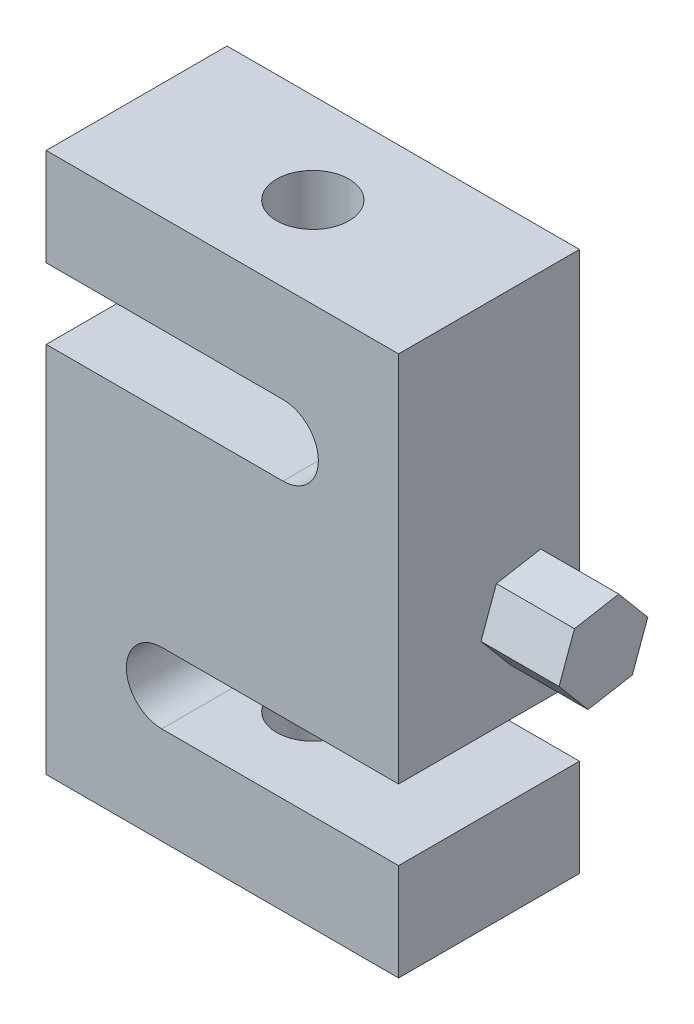
ISO-10303-21;
HEADER;
FILE_DESCRIPTION(('STEP AP214'),'2;1');
FILE_NAME('part.step','',(''),(''),'','','');
FILE_SCHEMA(('AUTOMOTIVE_DESIGN { 1 0 10303 214 1 1 1 1 }'));
ENDSEC;
DATA;
#1=APPLICATION_CONTEXT('core data for automotive mechanical design processes');
#2=APPLICATION_PROTOCOL_DEFINITION('international standard','automotive_design',2000,#1);
#3=PRODUCT_CONTEXT('',#1,'mechanical');
#4=PRODUCT('Part','Part','',(#3));
#5=PRODUCT_RELATED_PRODUCT_CATEGORY('part','',(#4));
#6=PRODUCT_DEFINITION_FORMATION('','',#4);
#7=PRODUCT_DEFINITION_CONTEXT('part definition',#1,'design');
#8=PRODUCT_DEFINITION('design','',#6,#7);
#9=PRODUCT_DEFINITION_SHAPE('','',#8);
#10=(LENGTH_UNIT() NAMED_UNIT(*) SI_UNIT(.MILLI.,.METRE.));
#11=(NAMED_UNIT(*) PLANE_ANGLE_UNIT() SI_UNIT($,.RADIAN.));
#12=(NAMED_UNIT(*) SI_UNIT($,.STERADIAN.) SOLID_ANGLE_UNIT());
#13=UNCERTAINTY_MEASURE_WITH_UNIT(LENGTH_MEASURE(1.E-05),#10,'distance_accuracy_value','');
#14=(GEOMETRIC_REPRESENTATION_CONTEXT(3) GLOBAL_UNCERTAINTY_ASSIGNED_CONTEXT((#13)) GLOBAL_UNIT_ASSIGNED_CONTEXT((#10,
#11,#12)) REPRESENTATION_CONTEXT('',''));
#15=CARTESIAN_POINT('',(0.,0.,0.));
#16=DIRECTION('',(0.,0.,1.));
#17=DIRECTION('',(1.,0.,0.));
#18=AXIS2_PLACEMENT_3D('',#15,#16,#17);
#19=CARTESIAN_POINT('',(0.,38.0873,25.4889));
#20=DIRECTION('',(0.,-1.,0.));
#21=DIRECTION('',(1.,0.,0.));
#22=AXIS2_PLACEMENT_3D('',#19,#20,#21);
#23=PLANE('',#22);
#24=DIRECTION('',(-1.,0.,0.));
#25=VECTOR('',#24,1.);
#26=CARTESIAN_POINT('',(0.,38.0873,0.));
#27=LINE('',#26,#25);
#28=CARTESIAN_POINT('',(24.8285,38.0873,0.));
#29=VERTEX_POINT('',#28);
#30=CARTESIAN_POINT('',(-24.8285,38.0873,0.));
#31=VERTEX_POINT('',#30);
#32=EDGE_CURVE('E279',#29,#31,#27,.T.);
#33=ORIENTED_EDGE('',*,*,#32,.T.);
#34=DIRECTION('',(0.,0.,-1.));
#35=VECTOR('',#34,1.);
#36=CARTESIAN_POINT('',(-24.8285,38.0873,25.4889));
#37=LINE('',#36,#35);
#38=CARTESIAN_POINT('',(-24.8285,38.0873,25.4889));
#39=VERTEX_POINT('',#38);
#40=EDGE_CURVE('E286',#39,#31,#37,.T.);
#41=ORIENTED_EDGE('',*,*,#40,.F.);
#42=DIRECTION('',(-1.,0.,0.));
#43=VECTOR('',#42,1.);
#44=CARTESIAN_POINT('',(0.,38.0873,25.4889));
#45=LINE('',#44,#43);
#46=CARTESIAN_POINT('',(24.8285,38.0873,25.4889));
#47=VERTEX_POINT('',#46);
#48=EDGE_CURVE('E245',#47,#39,#45,.T.);
#49=ORIENTED_EDGE('',*,*,#48,.F.);
#50=DIRECTION('',(0.,0.,-1.));
#51=VECTOR('',#50,1.);
#52=CARTESIAN_POINT('',(24.8285,38.0873,25.4889));
#53=LINE('',#52,#51);
#54=EDGE_CURVE('E289',#47,#29,#53,.T.);
#55=ORIENTED_EDGE('',*,*,#54,.T.);
#56=EDGE_LOOP('',(#33,#41,#49,#55));
#57=FACE_BOUND('',#56,.T.);
#58=CARTESIAN_POINT('',(0.,38.0873,12.74445));
#59=DIRECTION('',(0.,1.,0.));
#60=DIRECTION('',(0.,0.,1.));
#61=AXIS2_PLACEMENT_3D('',#58,#59,#60);
#62=CIRCLE('',#61,5.1);
#63=CARTESIAN_POINT('',(0.,38.0873,17.84445));
#64=VERTEX_POINT('',#63);
#65=EDGE_CURVE('E411',#64,#64,#62,.T.);
#66=ORIENTED_EDGE('',*,*,#65,.F.);
#67=EDGE_LOOP('',(#66));
#68=FACE_BOUND('',#67,.T.);
#69=ADVANCED_FACE('F47',(#57,#68),#23,.F.);
#70=CARTESIAN_POINT('',(24.8285,0.,25.4889));
#71=DIRECTION('',(-1.,0.,0.));
#72=DIRECTION('',(0.,0.,1.));
#73=AXIS2_PLACEMENT_3D('',#70,#71,#72);
#74=PLANE('',#73);
#75=DIRECTION('',(0.,1.,0.));
#76=VECTOR('',#75,1.);
#77=CARTESIAN_POINT('',(24.8285,0.,0.));
#78=LINE('',#77,#76);
#79=CARTESIAN_POINT('',(24.8285,-14.4145,0.));
#80=VERTEX_POINT('',#79);
#81=EDGE_CURVE('E267',#80,#29,#78,.T.);
#82=ORIENTED_EDGE('',*,*,#81,.T.);
#83=ORIENTED_EDGE('',*,*,#54,.F.);
#84=DIRECTION('',(0.,1.,0.));
#85=VECTOR('',#84,1.);
#86=CARTESIAN_POINT('',(24.8285,0.,25.4889));
#87=LINE('',#86,#85);
#88=CARTESIAN_POINT('',(24.8285,-14.4145,25.4889));
#89=VERTEX_POINT('',#88);
#90=EDGE_CURVE('E234',#89,#47,#87,.T.);
#91=ORIENTED_EDGE('',*,*,#90,.F.);
#92=DIRECTION('',(0.,0.,-1.));
#93=VECTOR('',#92,1.);
#94=CARTESIAN_POINT('',(24.8285,-14.4145,25.4889));
#95=LINE('',#94,#93);
#96=EDGE_CURVE('E293',#89,#80,#95,.T.);
#97=ORIENTED_EDGE('',*,*,#96,.T.);
#98=EDGE_LOOP('',(#82,#83,#91,#97));
#99=FACE_BOUND('',#98,.T.);
#100=DIRECTION('',(0.,-0.173422772092117,0.984847471499971));
#101=VECTOR('',#100,1.);
#102=CARTESIAN_POINT('',(24.8285,4.2520509016337,5.44680641952582));
#103=LINE('',#102,#101);
#104=CARTESIAN_POINT('',(24.8285,4.2520509016337,5.44680641952582));
#105=VERTEX_POINT('',#104);
#106=CARTESIAN_POINT('',(24.8285,3.15081629884875,11.7005878635506));
#107=VERTEX_POINT('',#106);
#108=EDGE_CURVE('E196',#105,#107,#103,.T.);
#109=ORIENTED_EDGE('',*,*,#108,.F.);
#110=DIRECTION('',(0.,0.766191543125787,0.642612261976477));
#111=VECTOR('',#110,1.);
#112=CARTESIAN_POINT('',(24.8285,-0.613265397215052,1.36621855597519));
#113=LINE('',#112,#111);
#114=CARTESIAN_POINT('',(24.8285,-0.613265397215052,1.36621855597519));
#115=VERTEX_POINT('',#114);
#116=EDGE_CURVE('E193',#115,#105,#113,.T.);
#117=ORIENTED_EDGE('',*,*,#116,.F.);
#118=DIRECTION('',(0.,0.939614315217904,-0.342235209523493));
#119=VECTOR('',#118,1.);
#120=CARTESIAN_POINT('',(24.8285,-6.57981629884874,3.53941213644937));
#121=LINE('',#120,#119);
#122=CARTESIAN_POINT('',(24.8285,-6.57981629884874,3.53941213644937));
#123=VERTEX_POINT('',#122);
#124=EDGE_CURVE('E446',#123,#115,#121,.T.);
#125=ORIENTED_EDGE('',*,*,#124,.F.);
#126=DIRECTION('',(0.,0.173422772092117,-0.984847471499971));
#127=VECTOR('',#126,1.);
#128=CARTESIAN_POINT('',(24.8285,-7.68105090163368,9.79319358047418));
#129=LINE('',#128,#127);
#130=CARTESIAN_POINT('',(24.8285,-7.68105090163368,9.79319358047418));
#131=VERTEX_POINT('',#130);
#132=EDGE_CURVE('E442',#131,#123,#129,.T.);
#133=ORIENTED_EDGE('',*,*,#132,.F.);
#134=DIRECTION('',(0.,-0.766191543125787,-0.642612261976477));
#135=VECTOR('',#134,1.);
#136=CARTESIAN_POINT('',(24.8285,-2.81573460278493,13.8737814440248));
#137=LINE('',#136,#135);
#138=CARTESIAN_POINT('',(24.8285,-2.81573460278493,13.8737814440248));
#139=VERTEX_POINT('',#138);
#140=EDGE_CURVE('E69',#139,#131,#137,.T.);
#141=ORIENTED_EDGE('',*,*,#140,.F.);
#142=DIRECTION('',(0.,-0.939614315217904,0.342235209523493));
#143=VECTOR('',#142,1.);
#144=CARTESIAN_POINT('',(24.8285,3.15081629884875,11.7005878635506));
#145=LINE('',#144,#143);
#146=EDGE_CURVE('E64',#107,#139,#145,.T.);
#147=ORIENTED_EDGE('',*,*,#146,.F.);
#148=EDGE_LOOP('',(#109,#117,#125,#133,#141,#147));
#149=FACE_BOUND('',#148,.T.);
#150=ADVANCED_FACE('F351',(#99,#149),#74,.F.);
#151=CARTESIAN_POINT('',(0.,24.3713,25.4889));
#152=DIRECTION('',(0.,1.,0.));
#153=DIRECTION('',(0.,0.,1.));
#154=AXIS2_PLACEMENT_3D('',#151,#152,#153);
#155=PLANE('',#154);
#156=CARTESIAN_POINT('',(0.,24.3713,12.74445));
#157=DIRECTION('',(0.,1.,0.));
#158=DIRECTION('',(0.,0.,1.));
#159=AXIS2_PLACEMENT_3D('',#156,#157,#158);
#160=CIRCLE('',#159,5.1);
#161=CARTESIAN_POINT('',(0.,24.3713,17.84445));
#162=VERTEX_POINT('',#161);
#163=EDGE_CURVE('E416',#162,#162,#160,.T.);
#164=ORIENTED_EDGE('',*,*,#163,.T.);
#165=EDGE_LOOP('',(#164));
#166=FACE_BOUND('',#165,.T.);
#167=DIRECTION('',(1.,0.,0.));
#168=VECTOR('',#167,1.);
#169=CARTESIAN_POINT('',(0.,24.3713,0.));
#170=LINE('',#169,#168);
#171=CARTESIAN_POINT('',(-24.8285,24.3713,0.));
#172=VERTEX_POINT('',#171);
#173=CARTESIAN_POINT('',(8.5471,24.3713,0.));
#174=VERTEX_POINT('',#173);
#175=EDGE_CURVE('E198',#172,#174,#170,.T.);
#176=ORIENTED_EDGE('',*,*,#175,.T.);
#177=DIRECTION('',(0.,0.,-1.));
#178=VECTOR('',#177,1.);
#179=CARTESIAN_POINT('',(8.5471,24.3713,25.4889));
#180=LINE('',#179,#178);
#181=CARTESIAN_POINT('',(8.5471,24.3713,25.4889));
#182=VERTEX_POINT('',#181);
#183=EDGE_CURVE('E11',#182,#174,#180,.T.);
#184=ORIENTED_EDGE('',*,*,#183,.F.);
#185=DIRECTION('',(1.,0.,0.));
#186=VECTOR('',#185,1.);
#187=CARTESIAN_POINT('',(0.,24.3713,25.4889));
#188=LINE('',#187,#186);
#189=CARTESIAN_POINT('',(-24.8285,24.3713,25.4889));
#190=VERTEX_POINT('',#189);
#191=EDGE_CURVE('E209',#190,#182,#188,.T.);
#192=ORIENTED_EDGE('',*,*,#191,.F.);
#193=DIRECTION('',(0.,0.,-1.));
#194=VECTOR('',#193,1.);
#195=CARTESIAN_POINT('',(-24.8285,24.3713,25.4889));
#196=LINE('',#195,#194);
#197=EDGE_CURVE('E283',#190,#172,#196,.T.);
#198=ORIENTED_EDGE('',*,*,#197,.T.);
#199=EDGE_LOOP('',(#176,#184,#192,#198));
#200=FACE_BOUND('',#199,.T.);
#201=ADVANCED_FACE('F49',(#166,#200),#155,.F.);
#202=CARTESIAN_POINT('',(8.5471,19.3929,25.4889));
#203=DIRECTION('',(0.,0.,-1.));
#204=DIRECTION('',(-1.,0.,0.));
#205=AXIS2_PLACEMENT_3D('',#202,#203,#204);
#206=CYLINDRICAL_SURFACE('',#205,4.9784);
#207=CARTESIAN_POINT('',(8.5471,19.3929,0.));
#208=DIRECTION('',(0.,0.,1.));
#209=DIRECTION('',(1.,0.,0.));
#210=AXIS2_PLACEMENT_3D('',#207,#208,#209);
#211=CIRCLE('',#210,4.9784);
#212=CARTESIAN_POINT('',(8.5471,14.4145,0.));
#213=VERTEX_POINT('',#212);
#214=EDGE_CURVE('E203',#174,#213,#211,.F.);
#215=ORIENTED_EDGE('',*,*,#214,.T.);
#216=DIRECTION('',(0.,0.,-1.));
#217=VECTOR('',#216,1.);
#218=CARTESIAN_POINT('',(8.5471,14.4145,25.4889));
#219=LINE('',#218,#217);
#220=CARTESIAN_POINT('',(8.5471,14.4145,25.4889));
#221=VERTEX_POINT('',#220);
#222=EDGE_CURVE('E57',#221,#213,#219,.T.);
#223=ORIENTED_EDGE('',*,*,#222,.F.);
#224=CARTESIAN_POINT('',(8.5471,19.3929,25.4889));
#225=DIRECTION('',(0.,0.,1.));
#226=DIRECTION('',(1.,0.,0.));
#227=AXIS2_PLACEMENT_3D('',#224,#225,#226);
#228=CIRCLE('',#227,4.9784);
#229=EDGE_CURVE('E213',#182,#221,#228,.F.);
#230=ORIENTED_EDGE('',*,*,#229,.F.);
#231=ORIENTED_EDGE('',*,*,#183,.T.);
#232=EDGE_LOOP('',(#215,#223,#230,#231));
#233=FACE_BOUND('',#232,.T.);
#234=ADVANCED_FACE('F322',(#233),#206,.F.);
#235=CARTESIAN_POINT('',(0.,14.4145,25.4889));
#236=DIRECTION('',(0.,1.,0.));
#237=DIRECTION('',(-1.,0.,0.));
#238=AXIS2_PLACEMENT_3D('',#235,#236,#237);
#239=PLANE('',#238);
#240=DIRECTION('',(1.,0.,0.));
#241=VECTOR('',#240,1.);
#242=CARTESIAN_POINT('',(0.,14.4145,0.));
#243=LINE('',#242,#241);
#244=CARTESIAN_POINT('',(-24.8285,14.4145,0.));
#245=VERTEX_POINT('',#244);
#246=EDGE_CURVE('E251',#245,#213,#243,.T.);
#247=ORIENTED_EDGE('',*,*,#246,.F.);
#248=DIRECTION('',(0.,0.,-1.));
#249=VECTOR('',#248,1.);
#250=CARTESIAN_POINT('',(-24.8285,14.4145,25.4889));
#251=LINE('',#250,#249);
#252=CARTESIAN_POINT('',(-24.8285,14.4145,25.4889));
#253=VERTEX_POINT('',#252);
#254=EDGE_CURVE('E312',#253,#245,#251,.T.);
#255=ORIENTED_EDGE('',*,*,#254,.F.);
#256=DIRECTION('',(1.,0.,0.));
#257=VECTOR('',#256,1.);
#258=CARTESIAN_POINT('',(0.,14.4145,25.4889));
#259=LINE('',#258,#257);
#260=EDGE_CURVE('E217',#253,#221,#259,.T.);
#261=ORIENTED_EDGE('',*,*,#260,.T.);
#262=ORIENTED_EDGE('',*,*,#222,.T.);
#263=EDGE_LOOP('',(#247,#255,#261,#262));
#264=FACE_BOUND('',#263,.T.);
#265=ADVANCED_FACE('F319',(#264),#239,.T.);
#266=CARTESIAN_POINT('',(-24.8285,0.,25.4889));
#267=DIRECTION('',(-1.,0.,0.));
#268=DIRECTION('',(0.,0.,1.));
#269=AXIS2_PLACEMENT_3D('',#266,#267,#268);
#270=PLANE('',#269);
#271=DIRECTION('',(0.,1.,0.));
#272=VECTOR('',#271,1.);
#273=CARTESIAN_POINT('',(-24.8285,0.,0.));
#274=LINE('',#273,#272);
#275=CARTESIAN_POINT('',(-24.8285,-38.0873,0.));
#276=VERTEX_POINT('',#275);
#277=EDGE_CURVE('E255',#276,#245,#274,.T.);
#278=ORIENTED_EDGE('',*,*,#277,.F.);
#279=DIRECTION('',(0.,0.,-1.));
#280=VECTOR('',#279,1.);
#281=CARTESIAN_POINT('',(-24.8285,-38.0873,25.4889));
#282=LINE('',#281,#280);
#283=CARTESIAN_POINT('',(-24.8285,-38.0873,25.4889));
#284=VERTEX_POINT('',#283);
#285=EDGE_CURVE('E309',#284,#276,#282,.T.);
#286=ORIENTED_EDGE('',*,*,#285,.F.);
#287=DIRECTION('',(0.,1.,0.));
#288=VECTOR('',#287,1.);
#289=CARTESIAN_POINT('',(-24.8285,0.,25.4889));
#290=LINE('',#289,#288);
#291=EDGE_CURVE('E221',#284,#253,#290,.T.);
#292=ORIENTED_EDGE('',*,*,#291,.T.);
#293=ORIENTED_EDGE('',*,*,#254,.T.);
#294=EDGE_LOOP('',(#278,#286,#292,#293));
#295=FACE_BOUND('',#294,.T.);
#296=ADVANCED_FACE('F331',(#295),#270,.T.);
#297=CARTESIAN_POINT('',(0.,-38.0873,25.4889));
#298=DIRECTION('',(0.,-1.,0.));
#299=DIRECTION('',(1.,0.,0.));
#300=AXIS2_PLACEMENT_3D('',#297,#298,#299);
#301=PLANE('',#300);
#302=CARTESIAN_POINT('',(0.,-38.0873,12.74445));
#303=DIRECTION('',(0.,-1.,0.));
#304=DIRECTION('',(0.,0.,-1.));
#305=AXIS2_PLACEMENT_3D('',#302,#303,#304);
#306=CIRCLE('',#305,5.1);
#307=CARTESIAN_POINT('',(0.,-38.0873,7.64445000000001));
#308=VERTEX_POINT('',#307);
#309=EDGE_CURVE('E412',#308,#308,#306,.T.);
#310=ORIENTED_EDGE('',*,*,#309,.F.);
#311=EDGE_LOOP('',(#310));
#312=FACE_BOUND('',#311,.T.);
#313=DIRECTION('',(-1.,0.,0.));
#314=VECTOR('',#313,1.);
#315=CARTESIAN_POINT('',(0.,-38.0873,0.));
#316=LINE('',#315,#314);
#317=CARTESIAN_POINT('',(24.8285,-38.0873,0.));
#318=VERTEX_POINT('',#317);
#319=EDGE_CURVE('E259',#318,#276,#316,.T.);
#320=ORIENTED_EDGE('',*,*,#319,.F.);
#321=DIRECTION('',(0.,0.,-1.));
#322=VECTOR('',#321,1.);
#323=CARTESIAN_POINT('',(24.8285,-38.0873,25.4889));
#324=LINE('',#323,#322);
#325=CARTESIAN_POINT('',(24.8285,-38.0873,25.4889));
#326=VERTEX_POINT('',#325);
#327=EDGE_CURVE('E306',#326,#318,#324,.T.);
#328=ORIENTED_EDGE('',*,*,#327,.F.);
#329=DIRECTION('',(-1.,0.,0.));
#330=VECTOR('',#329,1.);
#331=CARTESIAN_POINT('',(0.,-38.0873,25.4889));
#332=LINE('',#331,#330);
#333=EDGE_CURVE('E225',#326,#284,#332,.T.);
#334=ORIENTED_EDGE('',*,*,#333,.T.);
#335=ORIENTED_EDGE('',*,*,#285,.T.);
#336=EDGE_LOOP('',(#320,#328,#334,#335));
#337=FACE_BOUND('',#336,.T.);
#338=ADVANCED_FACE('F376',(#312,#337),#301,.T.);
#339=CARTESIAN_POINT('',(24.8285,-24.3713,0.));
#340=VERTEX_POINT('',#339);
#341=EDGE_CURVE('E263',#318,#340,#78,.T.);
#342=ORIENTED_EDGE('',*,*,#341,.T.);
#343=DIRECTION('',(0.,0.,-1.));
#344=VECTOR('',#343,1.);
#345=CARTESIAN_POINT('',(24.8285,-24.3713,25.4889));
#346=LINE('',#345,#344);
#347=CARTESIAN_POINT('',(24.8285,-24.3713,25.4889));
#348=VERTEX_POINT('',#347);
#349=EDGE_CURVE('E302',#348,#340,#346,.T.);
#350=ORIENTED_EDGE('',*,*,#349,.F.);
#351=EDGE_CURVE('E230',#326,#348,#87,.T.);
#352=ORIENTED_EDGE('',*,*,#351,.F.);
#353=ORIENTED_EDGE('',*,*,#327,.T.);
#354=EDGE_LOOP('',(#342,#350,#352,#353));
#355=FACE_BOUND('',#354,.T.);
#356=ADVANCED_FACE('F374',(#355),#74,.F.);
#357=CARTESIAN_POINT('',(0.,-24.3713,25.4889));
#358=DIRECTION('',(0.,-1.,0.));
#359=DIRECTION('',(1.,0.,0.));
#360=AXIS2_PLACEMENT_3D('',#357,#358,#359);
#361=PLANE('',#360);
#362=CARTESIAN_POINT('',(0.,-24.3713,12.74445));
#363=DIRECTION('',(0.,-1.,0.));
#364=DIRECTION('',(1.,0.,0.));
#365=AXIS2_PLACEMENT_3D('',#362,#363,#364);
#366=CIRCLE('',#365,5.1);
#367=CARTESIAN_POINT('',(5.1,-24.3713,12.74445));
#368=VERTEX_POINT('',#367);
#369=EDGE_CURVE('E51',#368,#368,#366,.T.);
#370=ORIENTED_EDGE('',*,*,#369,.T.);
#371=EDGE_LOOP('',(#370));
#372=FACE_BOUND('',#371,.T.);
#373=DIRECTION('',(-1.,0.,0.));
#374=VECTOR('',#373,1.);
#375=CARTESIAN_POINT('',(0.,-24.3713,0.));
#376=LINE('',#375,#374);
#377=CARTESIAN_POINT('',(-8.5471,-24.3713,0.));
#378=VERTEX_POINT('',#377);
#379=EDGE_CURVE('E266',#340,#378,#376,.T.);
#380=ORIENTED_EDGE('',*,*,#379,.T.);
#381=DIRECTION('',(0.,0.,-1.));
#382=VECTOR('',#381,1.);
#383=CARTESIAN_POINT('',(-8.5471,-24.3713,25.4889));
#384=LINE('',#383,#382);
#385=CARTESIAN_POINT('',(-8.5471,-24.3713,25.4889));
#386=VERTEX_POINT('',#385);
#387=EDGE_CURVE('E299',#386,#378,#384,.T.);
#388=ORIENTED_EDGE('',*,*,#387,.F.);
#389=DIRECTION('',(-1.,0.,0.));
#390=VECTOR('',#389,1.);
#391=CARTESIAN_POINT('',(0.,-24.3713,25.4889));
#392=LINE('',#391,#390);
#393=EDGE_CURVE('E233',#348,#386,#392,.T.);
#394=ORIENTED_EDGE('',*,*,#393,.F.);
#395=ORIENTED_EDGE('',*,*,#349,.T.);
#396=EDGE_LOOP('',(#380,#388,#394,#395));
#397=FACE_BOUND('',#396,.T.);
#398=ADVANCED_FACE('F370',(#372,#397),#361,.F.);
#399=CARTESIAN_POINT('',(-8.5471,-19.3929,25.4889));
#400=DIRECTION('',(0.,0.,-1.));
#401=DIRECTION('',(-1.,0.,0.));
#402=AXIS2_PLACEMENT_3D('',#399,#400,#401);
#403=CYLINDRICAL_SURFACE('',#402,4.9784);
#404=CARTESIAN_POINT('',(-8.5471,-19.3929,0.));
#405=DIRECTION('',(0.,0.,1.));
#406=DIRECTION('',(1.,0.,0.));
#407=AXIS2_PLACEMENT_3D('',#404,#405,#406);
#408=CIRCLE('',#407,4.9784);
#409=CARTESIAN_POINT('',(-8.5471,-14.4145,0.));
#410=VERTEX_POINT('',#409);
#411=EDGE_CURVE('E271',#410,#378,#408,.T.);
#412=ORIENTED_EDGE('',*,*,#411,.F.);
#413=DIRECTION('',(0.,0.,-1.));
#414=VECTOR('',#413,1.);
#415=CARTESIAN_POINT('',(-8.5471,-14.4145,25.4889));
#416=LINE('',#415,#414);
#417=CARTESIAN_POINT('',(-8.5471,-14.4145,25.4889));
#418=VERTEX_POINT('',#417);
#419=EDGE_CURVE('E296',#418,#410,#416,.T.);
#420=ORIENTED_EDGE('',*,*,#419,.F.);
#421=CARTESIAN_POINT('',(-8.5471,-19.3929,25.4889));
#422=DIRECTION('',(0.,0.,1.));
#423=DIRECTION('',(1.,0.,0.));
#424=AXIS2_PLACEMENT_3D('',#421,#422,#423);
#425=CIRCLE('',#424,4.9784);
#426=EDGE_CURVE('E237',#418,#386,#425,.T.);
#427=ORIENTED_EDGE('',*,*,#426,.T.);
#428=ORIENTED_EDGE('',*,*,#387,.T.);
#429=EDGE_LOOP('',(#412,#420,#427,#428));
#430=FACE_BOUND('',#429,.T.);
#431=ADVANCED_FACE('F366',(#430),#403,.F.);
#432=CARTESIAN_POINT('',(0.,-14.4145,25.4889));
#433=DIRECTION('',(0.,-1.,0.));
#434=DIRECTION('',(1.,0.,0.));
#435=AXIS2_PLACEMENT_3D('',#432,#433,#434);
#436=PLANE('',#435);
#437=DIRECTION('',(-1.,0.,0.));
#438=VECTOR('',#437,1.);
#439=CARTESIAN_POINT('',(0.,-14.4145,0.));
#440=LINE('',#439,#438);
#441=EDGE_CURVE('E275',#80,#410,#440,.T.);
#442=ORIENTED_EDGE('',*,*,#441,.F.);
#443=ORIENTED_EDGE('',*,*,#96,.F.);
#444=DIRECTION('',(-1.,0.,0.));
#445=VECTOR('',#444,1.);
#446=CARTESIAN_POINT('',(0.,-14.4145,25.4889));
#447=LINE('',#446,#445);
#448=EDGE_CURVE('E241',#89,#418,#447,.T.);
#449=ORIENTED_EDGE('',*,*,#448,.T.);
#450=ORIENTED_EDGE('',*,*,#419,.T.);
#451=EDGE_LOOP('',(#442,#443,#449,#450));
#452=FACE_BOUND('',#451,.T.);
#453=ADVANCED_FACE('F362',(#452),#436,.T.);
#454=EDGE_CURVE('E214',#172,#31,#274,.T.);
#455=ORIENTED_EDGE('',*,*,#454,.F.);
#456=ORIENTED_EDGE('',*,*,#197,.F.);
#457=EDGE_CURVE('E226',#190,#39,#290,.T.);
#458=ORIENTED_EDGE('',*,*,#457,.T.);
#459=ORIENTED_EDGE('',*,*,#40,.T.);
#460=EDGE_LOOP('',(#455,#456,#458,#459));
#461=FACE_BOUND('',#460,.T.);
#462=ADVANCED_FACE('F344',(#461),#270,.T.);
#463=CARTESIAN_POINT('',(0.,0.,25.4889));
#464=DIRECTION('',(0.,0.,1.));
#465=DIRECTION('',(1.,0.,0.));
#466=AXIS2_PLACEMENT_3D('',#463,#464,#465);
#467=PLANE('',#466);
#468=ORIENTED_EDGE('',*,*,#191,.T.);
#469=ORIENTED_EDGE('',*,*,#229,.T.);
#470=ORIENTED_EDGE('',*,*,#260,.F.);
#471=ORIENTED_EDGE('',*,*,#291,.F.);
#472=ORIENTED_EDGE('',*,*,#333,.F.);
#473=ORIENTED_EDGE('',*,*,#351,.T.);
#474=ORIENTED_EDGE('',*,*,#393,.T.);
#475=ORIENTED_EDGE('',*,*,#426,.F.);
#476=ORIENTED_EDGE('',*,*,#448,.F.);
#477=ORIENTED_EDGE('',*,*,#90,.T.);
#478=ORIENTED_EDGE('',*,*,#48,.T.);
#479=ORIENTED_EDGE('',*,*,#457,.F.);
#480=EDGE_LOOP('',(#468,#469,#470,#471,#472,#473,#474,#475,#476,#477,#478,#479));
#481=FACE_BOUND('',#480,.T.);
#482=ADVANCED_FACE('F334',(#481),#467,.T.);
#483=CARTESIAN_POINT('',(0.,0.,0.));
#484=DIRECTION('',(0.,0.,1.));
#485=DIRECTION('',(1.,0.,0.));
#486=AXIS2_PLACEMENT_3D('',#483,#484,#485);
#487=PLANE('',#486);
#488=ORIENTED_EDGE('',*,*,#175,.F.);
#489=ORIENTED_EDGE('',*,*,#454,.T.);
#490=ORIENTED_EDGE('',*,*,#32,.F.);
#491=ORIENTED_EDGE('',*,*,#81,.F.);
#492=ORIENTED_EDGE('',*,*,#441,.T.);
#493=ORIENTED_EDGE('',*,*,#411,.T.);
#494=ORIENTED_EDGE('',*,*,#379,.F.);
#495=ORIENTED_EDGE('',*,*,#341,.F.);
#496=ORIENTED_EDGE('',*,*,#319,.T.);
#497=ORIENTED_EDGE('',*,*,#277,.T.);
#498=ORIENTED_EDGE('',*,*,#246,.T.);
#499=ORIENTED_EDGE('',*,*,#214,.F.);
#500=EDGE_LOOP('',(#488,#489,#490,#491,#492,#493,#494,#495,#496,#497,#498,#499));
#501=FACE_BOUND('',#500,.T.);
#502=ADVANCED_FACE('F326',(#501),#487,.F.);
#503=CARTESIAN_POINT('',(35.8267,4.2520509016337,5.44680641952582));
#504=DIRECTION('',(0.,-0.984847471499971,-0.173422772092117));
#505=DIRECTION('',(0.,0.173422772092117,-0.984847471499971));
#506=AXIS2_PLACEMENT_3D('',#503,#504,#505);
#507=PLANE('',#506);
#508=ORIENTED_EDGE('',*,*,#108,.T.);
#509=DIRECTION('',(-1.,0.,0.));
#510=VECTOR('',#509,1.);
#511=CARTESIAN_POINT('',(35.8267,3.15081629884875,11.7005878635506));
#512=LINE('',#511,#510);
#513=CARTESIAN_POINT('',(35.8267,3.15081629884875,11.7005878635506));
#514=VERTEX_POINT('',#513);
#515=EDGE_CURVE('E175',#514,#107,#512,.T.);
#516=ORIENTED_EDGE('',*,*,#515,.F.);
#517=DIRECTION('',(0.,-0.173422772092117,0.984847471499971));
#518=VECTOR('',#517,1.);
#519=CARTESIAN_POINT('',(35.8267,4.2520509016337,5.44680641952582));
#520=LINE('',#519,#518);
#521=CARTESIAN_POINT('',(35.8267,4.2520509016337,5.44680641952582));
#522=VERTEX_POINT('',#521);
#523=EDGE_CURVE('E183',#522,#514,#520,.T.);
#524=ORIENTED_EDGE('',*,*,#523,.F.);
#525=DIRECTION('',(-1.,0.,0.));
#526=VECTOR('',#525,1.);
#527=CARTESIAN_POINT('',(35.8267,4.2520509016337,5.44680641952582));
#528=LINE('',#527,#526);
#529=EDGE_CURVE('E435',#522,#105,#528,.T.);
#530=ORIENTED_EDGE('',*,*,#529,.T.);
#531=EDGE_LOOP('',(#508,#516,#524,#530));
#532=FACE_BOUND('',#531,.T.);
#533=ADVANCED_FACE('F195',(#532),#507,.F.);
#534=CARTESIAN_POINT('',(35.8267,3.15081629884875,11.7005878635506));
#535=DIRECTION('',(0.,-0.342235209523493,-0.939614315217904));
#536=DIRECTION('',(0.,0.939614315217904,-0.342235209523493));
#537=AXIS2_PLACEMENT_3D('',#534,#535,#536);
#538=PLANE('',#537);
#539=ORIENTED_EDGE('',*,*,#146,.T.);
#540=DIRECTION('',(-1.,0.,0.));
#541=VECTOR('',#540,1.);
#542=CARTESIAN_POINT('',(35.8267,-2.81573460278493,13.8737814440248));
#543=LINE('',#542,#541);
#544=CARTESIAN_POINT('',(35.8267,-2.81573460278493,13.8737814440248));
#545=VERTEX_POINT('',#544);
#546=EDGE_CURVE('E178',#545,#139,#543,.T.);
#547=ORIENTED_EDGE('',*,*,#546,.F.);
#548=DIRECTION('',(0.,-0.939614315217904,0.342235209523493));
#549=VECTOR('',#548,1.);
#550=CARTESIAN_POINT('',(35.8267,3.15081629884875,11.7005878635506));
#551=LINE('',#550,#549);
#552=EDGE_CURVE('E171',#514,#545,#551,.T.);
#553=ORIENTED_EDGE('',*,*,#552,.F.);
#554=ORIENTED_EDGE('',*,*,#515,.T.);
#555=EDGE_LOOP('',(#539,#547,#553,#554));
#556=FACE_BOUND('',#555,.T.);
#557=ADVANCED_FACE('F173',(#556),#538,.F.);
#558=CARTESIAN_POINT('',(35.8267,-2.81573460278493,13.8737814440248));
#559=DIRECTION('',(0.,0.642612261976478,-0.766191543125787));
#560=DIRECTION('',(0.,0.766191543125787,0.642612261976478));
#561=AXIS2_PLACEMENT_3D('',#558,#559,#560);
#562=PLANE('',#561);
#563=ORIENTED_EDGE('',*,*,#140,.T.);
#564=DIRECTION('',(-1.,0.,0.));
#565=VECTOR('',#564,1.);
#566=CARTESIAN_POINT('',(35.8267,-7.68105090163368,9.79319358047418));
#567=LINE('',#566,#565);
#568=CARTESIAN_POINT('',(35.8267,-7.68105090163368,9.79319358047418));
#569=VERTEX_POINT('',#568);
#570=EDGE_CURVE('E205',#569,#131,#567,.T.);
#571=ORIENTED_EDGE('',*,*,#570,.F.);
#572=DIRECTION('',(0.,-0.766191543125787,-0.642612261976477));
#573=VECTOR('',#572,1.);
#574=CARTESIAN_POINT('',(35.8267,-2.81573460278493,13.8737814440248));
#575=LINE('',#574,#573);
#576=EDGE_CURVE('E182',#545,#569,#575,.T.);
#577=ORIENTED_EDGE('',*,*,#576,.F.);
#578=ORIENTED_EDGE('',*,*,#546,.T.);
#579=EDGE_LOOP('',(#563,#571,#577,#578));
#580=FACE_BOUND('',#579,.T.);
#581=ADVANCED_FACE('F470',(#580),#562,.F.);
#582=CARTESIAN_POINT('',(35.8267,-7.68105090163368,9.79319358047418));
#583=DIRECTION('',(0.,0.984847471499971,0.173422772092117));
#584=DIRECTION('',(0.,-0.173422772092117,0.984847471499971));
#585=AXIS2_PLACEMENT_3D('',#582,#583,#584);
#586=PLANE('',#585);
#587=ORIENTED_EDGE('',*,*,#132,.T.);
#588=DIRECTION('',(-1.,0.,0.));
#589=VECTOR('',#588,1.);
#590=CARTESIAN_POINT('',(35.8267,-6.57981629884874,3.53941213644937));
#591=LINE('',#590,#589);
#592=CARTESIAN_POINT('',(35.8267,-6.57981629884874,3.53941213644937));
#593=VERTEX_POINT('',#592);
#594=EDGE_CURVE('E459',#593,#123,#591,.T.);
#595=ORIENTED_EDGE('',*,*,#594,.F.);
#596=DIRECTION('',(0.,0.173422772092117,-0.984847471499971));
#597=VECTOR('',#596,1.);
#598=CARTESIAN_POINT('',(35.8267,-7.68105090163368,9.79319358047418));
#599=LINE('',#598,#597);
#600=EDGE_CURVE('E427',#569,#593,#599,.T.);
#601=ORIENTED_EDGE('',*,*,#600,.F.);
#602=ORIENTED_EDGE('',*,*,#570,.T.);
#603=EDGE_LOOP('',(#587,#595,#601,#602));
#604=FACE_BOUND('',#603,.T.);
#605=ADVANCED_FACE('F467',(#604),#586,.F.);
#606=CARTESIAN_POINT('',(35.8267,-6.57981629884874,3.53941213644937));
#607=DIRECTION('',(0.,0.342235209523493,0.939614315217904));
#608=DIRECTION('',(0.,-0.939614315217904,0.342235209523493));
#609=AXIS2_PLACEMENT_3D('',#606,#607,#608);
#610=PLANE('',#609);
#611=ORIENTED_EDGE('',*,*,#124,.T.);
#612=DIRECTION('',(-1.,0.,0.));
#613=VECTOR('',#612,1.);
#614=CARTESIAN_POINT('',(35.8267,-0.613265397215052,1.36621855597519));
#615=LINE('',#614,#613);
#616=CARTESIAN_POINT('',(35.8267,-0.613265397215052,1.36621855597519));
#617=VERTEX_POINT('',#616);
#618=EDGE_CURVE('E455',#617,#115,#615,.T.);
#619=ORIENTED_EDGE('',*,*,#618,.F.);
#620=DIRECTION('',(0.,0.939614315217904,-0.342235209523493));
#621=VECTOR('',#620,1.);
#622=CARTESIAN_POINT('',(35.8267,-6.57981629884874,3.53941213644937));
#623=LINE('',#622,#621);
#624=EDGE_CURVE('E430',#593,#617,#623,.T.);
#625=ORIENTED_EDGE('',*,*,#624,.F.);
#626=ORIENTED_EDGE('',*,*,#594,.T.);
#627=EDGE_LOOP('',(#611,#619,#625,#626));
#628=FACE_BOUND('',#627,.T.);
#629=ADVANCED_FACE('F474',(#628),#610,.F.);
#630=CARTESIAN_POINT('',(35.8267,-0.613265397215052,1.36621855597519));
#631=DIRECTION('',(0.,-0.642612261976478,0.766191543125787));
#632=DIRECTION('',(0.,-0.766191543125787,-0.642612261976478));
#633=AXIS2_PLACEMENT_3D('',#630,#631,#632);
#634=PLANE('',#633);
#635=ORIENTED_EDGE('',*,*,#116,.T.);
#636=ORIENTED_EDGE('',*,*,#529,.F.);
#637=DIRECTION('',(0.,0.766191543125787,0.642612261976477));
#638=VECTOR('',#637,1.);
#639=CARTESIAN_POINT('',(35.8267,-0.613265397215052,1.36621855597519));
#640=LINE('',#639,#638);
#641=EDGE_CURVE('E188',#617,#522,#640,.T.);
#642=ORIENTED_EDGE('',*,*,#641,.F.);
#643=ORIENTED_EDGE('',*,*,#618,.T.);
#644=EDGE_LOOP('',(#635,#636,#642,#643));
#645=FACE_BOUND('',#644,.T.);
#646=ADVANCED_FACE('F476',(#645),#634,.F.);
#647=CARTESIAN_POINT('',(35.8267,0.,0.));
#648=DIRECTION('',(1.,0.,0.));
#649=DIRECTION('',(0.,0.,-1.));
#650=AXIS2_PLACEMENT_3D('',#647,#648,#649);
#651=PLANE('',#650);
#652=ORIENTED_EDGE('',*,*,#523,.T.);
#653=ORIENTED_EDGE('',*,*,#552,.T.);
#654=ORIENTED_EDGE('',*,*,#576,.T.);
#655=ORIENTED_EDGE('',*,*,#600,.T.);
#656=ORIENTED_EDGE('',*,*,#624,.T.);
#657=ORIENTED_EDGE('',*,*,#641,.T.);
#658=EDGE_LOOP('',(#652,#653,#654,#655,#656,#657));
#659=FACE_BOUND('',#658,.T.);
#660=ADVANCED_FACE('F186',(#659),#651,.T.);
#661=CARTESIAN_POINT('',(0.,38.0873,12.74445));
#662=DIRECTION('',(0.,1.,0.));
#663=DIRECTION('',(0.,0.,1.));
#664=AXIS2_PLACEMENT_3D('',#661,#662,#663);
#665=CYLINDRICAL_SURFACE('',#664,5.1);
#666=ORIENTED_EDGE('',*,*,#65,.T.);
#667=EDGE_LOOP('',(#666));
#668=FACE_BOUND('',#667,.T.);
#669=ORIENTED_EDGE('',*,*,#163,.F.);
#670=EDGE_LOOP('',(#669));
#671=FACE_BOUND('',#670,.T.);
#672=ADVANCED_FACE('F482',(#668,#671),#665,.F.);
#673=CARTESIAN_POINT('',(0.,-38.0873,12.74445));
#674=DIRECTION('',(0.,-1.,0.));
#675=DIRECTION('',(0.,0.,-1.));
#676=AXIS2_PLACEMENT_3D('',#673,#674,#675);
#677=CYLINDRICAL_SURFACE('',#676,5.1);
#678=ORIENTED_EDGE('',*,*,#309,.T.);
#679=EDGE_LOOP('',(#678));
#680=FACE_BOUND('',#679,.T.);
#681=ORIENTED_EDGE('',*,*,#369,.F.);
#682=EDGE_LOOP('',(#681));
#683=FACE_BOUND('',#682,.T.);
#684=ADVANCED_FACE('F554',(#680,#683),#677,.F.);
#685=CLOSED_SHELL('',(#69,#150,#201,#234,#265,#296,#338,#356,#398,#431,#453,#462,#482,#502,#533,
#557,#581,#605,#629,#646,#660,#672,#684));
#686=MANIFOLD_SOLID_BREP('B2',#685);
#687=ADVANCED_BREP_SHAPE_REPRESENTATION('',(#18,#686),#14);
#688=SHAPE_DEFINITION_REPRESENTATION(#9,#687);
ENDSEC;
END-ISO-10303-21;
